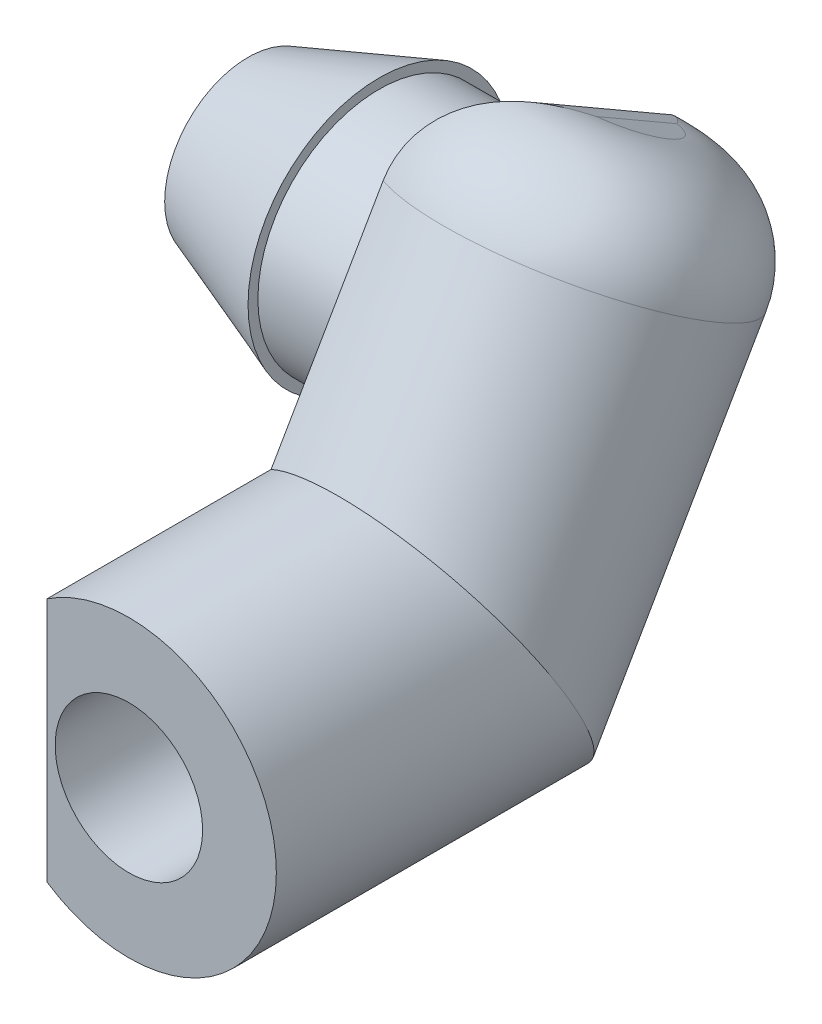
ISO-10303-21;
HEADER;
FILE_DESCRIPTION(('STEP AP214'),'2;1');
FILE_NAME('part.step','',(''),(''),'','','');
FILE_SCHEMA(('AUTOMOTIVE_DESIGN { 1 0 10303 214 1 1 1 1 }'));
ENDSEC;
DATA;
#1=APPLICATION_CONTEXT('core data for automotive mechanical design processes');
#2=APPLICATION_PROTOCOL_DEFINITION('international standard','automotive_design',2000,#1);
#3=PRODUCT_CONTEXT('',#1,'mechanical');
#4=PRODUCT('Part','Part','',(#3));
#5=PRODUCT_RELATED_PRODUCT_CATEGORY('part','',(#4));
#6=PRODUCT_DEFINITION_FORMATION('','',#4);
#7=PRODUCT_DEFINITION_CONTEXT('part definition',#1,'design');
#8=PRODUCT_DEFINITION('design','',#6,#7);
#9=PRODUCT_DEFINITION_SHAPE('','',#8);
#10=(LENGTH_UNIT() NAMED_UNIT(*) SI_UNIT(.MILLI.,.METRE.));
#11=(NAMED_UNIT(*) PLANE_ANGLE_UNIT() SI_UNIT($,.RADIAN.));
#12=(NAMED_UNIT(*) SI_UNIT($,.STERADIAN.) SOLID_ANGLE_UNIT());
#13=UNCERTAINTY_MEASURE_WITH_UNIT(LENGTH_MEASURE(1.E-05),#10,'distance_accuracy_value','');
#14=(GEOMETRIC_REPRESENTATION_CONTEXT(3) GLOBAL_UNCERTAINTY_ASSIGNED_CONTEXT((#13)) GLOBAL_UNIT_ASSIGNED_CONTEXT((#10,
#11,#12)) REPRESENTATION_CONTEXT('',''));
#15=CARTESIAN_POINT('',(0.,0.,0.));
#16=DIRECTION('',(0.,0.,1.));
#17=DIRECTION('',(1.,0.,0.));
#18=AXIS2_PLACEMENT_3D('',#15,#16,#17);
#19=CARTESIAN_POINT('',(-1.25,-0.804310319560903,-1.87538432102024));
#20=DIRECTION('',(1.,0.,0.));
#21=DIRECTION('',(0.,0.,-1.));
#22=AXIS2_PLACEMENT_3D('',#19,#20,#21);
#23=PLANE('',#22);
#24=DIRECTION('',(0.,-0.499999999999998,-0.86602540378444));
#25=VECTOR('',#24,1.);
#26=CARTESIAN_POINT('',(-1.25,4.83252866372346,-5.12981482539802));
#27=LINE('',#26,#25);
#28=CARTESIAN_POINT('',(-1.25,4.83252866372346,-5.12981482539802));
#29=VERTEX_POINT('',#28);
#30=CARTESIAN_POINT('',(-1.25,4.66491909115015,-5.42012312092989));
#31=VERTEX_POINT('',#30);
#32=EDGE_CURVE('E272',#29,#31,#27,.T.);
#33=ORIENTED_EDGE('',*,*,#32,.T.);
#34=CARTESIAN_POINT('',(-1.25,3.02067456655205,-6.26803817760076));
#35=DIRECTION('',(-1.,0.,0.));
#36=DIRECTION('',(0.,0.,1.));
#37=AXIS2_PLACEMENT_3D('',#34,#35,#36);
#38=CIRCLE('',#37,1.85);
#39=CARTESIAN_POINT('',(-1.25,2.09567456655206,-7.87018517460196));
#40=VERTEX_POINT('',#39);
#41=EDGE_CURVE('E59',#40,#31,#38,.T.);
#42=ORIENTED_EDGE('',*,*,#41,.F.);
#43=DIRECTION('',(0.,0.86602540378444,-0.499999999999998));
#44=VECTOR('',#43,1.);
#45=CARTESIAN_POINT('',(-1.25,-2.67513901294786,-5.11575467022417));
#46=LINE('',#45,#44);
#47=CARTESIAN_POINT('',(-1.25,-1.87082869338697,-5.58012344973465));
#48=VERTEX_POINT('',#47);
#49=EDGE_CURVE('E251',#48,#40,#46,.T.);
#50=ORIENTED_EDGE('',*,*,#49,.F.);
#51=DIRECTION('',(0.,0.866025403784438,0.500000000000001));
#52=VECTOR('',#51,1.);
#53=CARTESIAN_POINT('',(-1.25,3.35167867855522,-2.56490741269901));
#54=LINE('',#53,#52);
#55=CARTESIAN_POINT('',(-1.25,1.87082869338697,-3.41987655026535));
#56=VERTEX_POINT('',#55);
#57=EDGE_CURVE('E299',#48,#56,#54,.T.);
#58=ORIENTED_EDGE('',*,*,#57,.T.);
#59=DIRECTION('',(0.,0.86602540378444,-0.499999999999998));
#60=VECTOR('',#59,1.);
#61=CARTESIAN_POINT('',(-1.25,-0.804310319560903,-1.87538432102024));
#62=LINE('',#61,#60);
#63=EDGE_CURVE('E266',#56,#29,#62,.T.);
#64=ORIENTED_EDGE('',*,*,#63,.T.);
#65=EDGE_LOOP('',(#33,#42,#50,#58,#64));
#66=FACE_BOUND('',#65,.T.);
#67=ADVANCED_FACE('F35',(#66),#23,.F.);
#68=CARTESIAN_POINT('',(0.,5.19615242270664,-7.49999999999998));
#69=DIRECTION('',(0.,-0.86602540378444,0.499999999999998));
#70=DIRECTION('',(1.,0.,0.));
#71=AXIS2_PLACEMENT_3D('',#68,#69,#70);
#72=PLANE('',#71);
#73=CARTESIAN_POINT('',(0.,5.19615242270664,-7.49999999999998));
#74=DIRECTION('',(0.,-0.86602540378444,0.499999999999998));
#75=DIRECTION('',(0.,-0.499999999999998,-0.86602540378444));
#76=AXIS2_PLACEMENT_3D('',#73,#74,#75);
#77=CIRCLE('',#76,0.75);
#78=CARTESIAN_POINT('',(0.25,5.54970581329991,-6.88762756430419));
#79=VERTEX_POINT('',#78);
#80=CARTESIAN_POINT('',(0.25,4.84259903211337,-8.11237243569578));
#81=VERTEX_POINT('',#80);
#82=EDGE_CURVE('E274',#79,#81,#77,.F.);
#83=ORIENTED_EDGE('',*,*,#82,.T.);
#84=DIRECTION('',(0.,-0.499999999999998,-0.86602540378444));
#85=VECTOR('',#84,1.);
#86=CARTESIAN_POINT('',(0.25,5.19615242270664,-7.49999999999998));
#87=LINE('',#86,#85);
#88=EDGE_CURVE('E276',#81,#79,#87,.F.);
#89=ORIENTED_EDGE('',*,*,#88,.T.);
#90=EDGE_LOOP('',(#83,#89));
#91=FACE_BOUND('',#90,.T.);
#92=ADVANCED_FACE('F213',(#91),#72,.F.);
#93=CARTESIAN_POINT('',(0.,0.,0.));
#94=DIRECTION('',(0.,0.,1.));
#95=DIRECTION('',(1.,0.,0.));
#96=AXIS2_PLACEMENT_3D('',#93,#94,#95);
#97=PLANE('',#96);
#98=CARTESIAN_POINT('',(0.,0.,0.));
#99=DIRECTION('',(0.,0.,1.));
#100=DIRECTION('',(1.,0.,0.));
#101=AXIS2_PLACEMENT_3D('',#98,#99,#100);
#102=CIRCLE('',#101,1.125);
#103=CARTESIAN_POINT('',(1.125,0.,0.));
#104=VERTEX_POINT('',#103);
#105=EDGE_CURVE('E169',#104,#104,#102,.T.);
#106=ORIENTED_EDGE('',*,*,#105,.F.);
#107=EDGE_LOOP('',(#106));
#108=FACE_BOUND('',#107,.T.);
#109=CARTESIAN_POINT('',(0.,0.,0.));
#110=DIRECTION('',(0.,0.,1.));
#111=DIRECTION('',(1.,0.,0.));
#112=AXIS2_PLACEMENT_3D('',#109,#110,#111);
#113=CIRCLE('',#112,2.25);
#114=CARTESIAN_POINT('',(-1.25,-1.87082869338697,0.));
#115=VERTEX_POINT('',#114);
#116=CARTESIAN_POINT('',(-1.25,1.87082869338697,0.));
#117=VERTEX_POINT('',#116);
#118=EDGE_CURVE('E258',#115,#117,#113,.T.);
#119=ORIENTED_EDGE('',*,*,#118,.T.);
#120=DIRECTION('',(0.,-1.,0.));
#121=VECTOR('',#120,1.);
#122=CARTESIAN_POINT('',(-1.25,1.87082869338697,0.));
#123=LINE('',#122,#121);
#124=EDGE_CURVE('E306',#117,#115,#123,.T.);
#125=ORIENTED_EDGE('',*,*,#124,.T.);
#126=EDGE_LOOP('',(#119,#125));
#127=FACE_BOUND('',#126,.T.);
#128=ADVANCED_FACE('F220',(#108,#127),#97,.T.);
#129=CARTESIAN_POINT('',(0.,-1.73972466625438,-3.49556949562221));
#130=DIRECTION('',(0.,0.86602540378444,-0.499999999999998));
#131=DIRECTION('',(0.,0.499999999999998,0.86602540378444));
#132=AXIS2_PLACEMENT_3D('',#129,#130,#131);
#133=CYLINDRICAL_SURFACE('',#132,2.25);
#134=ORIENTED_EDGE('',*,*,#49,.T.);
#135=CARTESIAN_POINT('',(-1.25,2.9616999703365,-8.37018517460196));
#136=VERTEX_POINT('',#135);
#137=EDGE_CURVE('E252',#40,#136,#46,.T.);
#138=ORIENTED_EDGE('',*,*,#137,.T.);
#139=CARTESIAN_POINT('',(0.,3.89711431702998,-6.74999999999999));
#140=DIRECTION('',(0.,-0.86602540378444,0.499999999999998));
#141=DIRECTION('',(0.,-0.499999999999998,-0.86602540378444));
#142=AXIS2_PLACEMENT_3D('',#139,#140,#141);
#143=CIRCLE('',#142,2.25);
#144=EDGE_CURVE('E124',#136,#29,#143,.T.);
#145=ORIENTED_EDGE('',*,*,#144,.T.);
#146=ORIENTED_EDGE('',*,*,#63,.F.);
#147=CARTESIAN_POINT('',(0.,0.,-4.5));
#148=DIRECTION('',(0.,0.500000000000001,-0.866025403784438));
#149=DIRECTION('',(0.,-0.866025403784438,-0.500000000000001));
#150=AXIS2_PLACEMENT_3D('',#147,#148,#149);
#151=ELLIPSE('',#150,2.59807621135332,2.25);
#152=EDGE_CURVE('E255',#56,#48,#151,.T.);
#153=ORIENTED_EDGE('',*,*,#152,.T.);
#154=EDGE_LOOP('',(#134,#138,#145,#146,#153));
#155=FACE_BOUND('',#154,.T.);
#156=ADVANCED_FACE('F228',(#155),#133,.T.);
#157=ORIENTED_EDGE('',*,*,#137,.F.);
#158=CARTESIAN_POINT('',(-1.25,3.10848084952282,-8.11595323427161));
#159=VERTEX_POINT('',#158);
#160=EDGE_CURVE('E159',#159,#40,#38,.T.);
#161=ORIENTED_EDGE('',*,*,#160,.F.);
#162=EDGE_CURVE('E264',#159,#136,#27,.T.);
#163=ORIENTED_EDGE('',*,*,#162,.T.);
#164=EDGE_LOOP('',(#157,#161,#163));
#165=FACE_BOUND('',#164,.T.);
#166=ADVANCED_FACE('F215',(#165),#23,.F.);
#167=CARTESIAN_POINT('',(-1.25,1.87082869338697,0.));
#168=DIRECTION('',(1.,0.,0.));
#169=DIRECTION('',(0.,0.,-1.));
#170=AXIS2_PLACEMENT_3D('',#167,#168,#169);
#171=PLANE('',#170);
#172=DIRECTION('',(0.,0.,-1.));
#173=VECTOR('',#172,1.);
#174=CARTESIAN_POINT('',(-1.25,-1.87082869338697,0.));
#175=LINE('',#174,#173);
#176=EDGE_CURVE('E308',#115,#48,#175,.T.);
#177=ORIENTED_EDGE('',*,*,#176,.F.);
#178=ORIENTED_EDGE('',*,*,#124,.F.);
#179=DIRECTION('',(0.,0.,-1.));
#180=VECTOR('',#179,1.);
#181=CARTESIAN_POINT('',(-1.25,1.87082869338697,0.));
#182=LINE('',#181,#180);
#183=EDGE_CURVE('E302',#117,#56,#182,.T.);
#184=ORIENTED_EDGE('',*,*,#183,.T.);
#185=ORIENTED_EDGE('',*,*,#57,.F.);
#186=EDGE_LOOP('',(#177,#178,#184,#185));
#187=FACE_BOUND('',#186,.T.);
#188=ADVANCED_FACE('F227',(#187),#171,.F.);
#189=CARTESIAN_POINT('',(0.,0.,0.));
#190=DIRECTION('',(0.,0.,-1.));
#191=DIRECTION('',(-1.,0.,0.));
#192=AXIS2_PLACEMENT_3D('',#189,#190,#191);
#193=CYLINDRICAL_SURFACE('',#192,2.25);
#194=ORIENTED_EDGE('',*,*,#183,.F.);
#195=ORIENTED_EDGE('',*,*,#118,.F.);
#196=ORIENTED_EDGE('',*,*,#176,.T.);
#197=ORIENTED_EDGE('',*,*,#152,.F.);
#198=EDGE_LOOP('',(#194,#195,#196,#197));
#199=FACE_BOUND('',#198,.T.);
#200=ADVANCED_FACE('F216',(#199),#193,.T.);
#201=CARTESIAN_POINT('',(0.,3.89711431702998,-6.74999999999999));
#202=DIRECTION('',(0.,-0.86602540378444,0.499999999999998));
#203=DIRECTION('',(0.,-0.499999999999998,-0.86602540378444));
#204=AXIS2_PLACEMENT_3D('',#201,#202,#203);
#205=DEGENERATE_TOROIDAL_SURFACE('',#204,0.75,1.5,.T.);
#206=CARTESIAN_POINT('',(-1.25,2.9616999703365,-8.37018517460196));
#207=CARTESIAN_POINT('',(-1.25000185479303,2.99479987181354,-8.38929473665628));
#208=CARTESIAN_POINT('',(-1.24853809279602,3.02827310512128,-8.40771909432136));
#209=CARTESIAN_POINT('',(-1.24271278594958,3.0957432628677,-8.44307374989157));
#210=CARTESIAN_POINT('',(-1.23835185493461,3.1297400748836,-8.46000436342148));
#211=CARTESIAN_POINT('',(-1.22101743592931,3.23193810336593,-8.50825691182083));
#212=CARTESIAN_POINT('',(-1.20379173667515,3.30060683069265,-8.53718948360161));
#213=CARTESIAN_POINT('',(-1.15881907855963,3.437114660384,-8.5876822704788));
#214=CARTESIAN_POINT('',(-1.13107520035981,3.50495399966777,-8.60924464071501));
#215=CARTESIAN_POINT('',(-1.06632808373223,3.63825290162302,-8.64439350943134));
#216=CARTESIAN_POINT('',(-1.02932124805396,3.70371152841237,-8.65797690241725));
#217=CARTESIAN_POINT('',(-0.946317688210517,3.83296422819545,-8.67705115237366));
#218=CARTESIAN_POINT('',(-0.900069594258949,3.89663659593368,-8.68226698534826));
#219=CARTESIAN_POINT('',(-0.801343058142091,4.01902622294201,-8.68356884724809));
#220=CARTESIAN_POINT('',(-0.74886300728282,4.07774219606577,-8.67965251394676));
#221=CARTESIAN_POINT('',(-0.634585325110853,4.19489437015482,-8.66190901299882));
#222=CARTESIAN_POINT('',(-0.572375272555579,4.25279158575031,-8.64718981376087));
#223=CARTESIAN_POINT('',(-0.445543018425509,4.3618717613418,-8.60707231393778));
#224=CARTESIAN_POINT('',(-0.380918963935079,4.4130494216905,-8.58166564985283));
#225=CARTESIAN_POINT('',(-0.243615062410326,4.51525937312719,-8.51660363132636));
#226=CARTESIAN_POINT('',(-0.170964010711523,4.56543278971332,-8.47553967205553));
#227=CARTESIAN_POINT('',(-0.0298225192133308,4.65918926734154,-8.3809494183145));
#228=CARTESIAN_POINT('',(0.0386724069630731,4.70277951319664,-8.32743687460706));
#229=CARTESIAN_POINT('',(0.153444321717618,4.77697723425207,-8.22152697176461));
#230=CARTESIAN_POINT('',(0.201317225497368,4.80834933404259,-8.1714075276888));
#231=CARTESIAN_POINT('',(0.246924781731042,4.84042751800417,-8.11612894617689));
#232=CARTESIAN_POINT('',(0.248464759539056,4.84151349086549,-8.11425270366045));
#233=CARTESIAN_POINT('',(0.25,4.84259903211337,-8.11237243569578));
#234=B_SPLINE_CURVE_WITH_KNOTS('',3,(#206,#207,#208,#209,#210,#211,#212,#213,#214,#215,#216,
#217,#218,#219,#220,#221,#222,#223,#224,#225,#226,#227,#228,#229,#230,#231,#232,#233),
.UNSPECIFIED.,.F.,.F.,(4,2,2,2,2,2,2,2,2,2,2,2,2,4),(0.,0.114586572621303,0.229148875079892,
0.457385298715112,0.685554925934998,0.913813300213431,1.14943077072409,1.38510919540159,
1.64281343984222,1.90071972759309,2.19167251062179,2.48230541927415,2.70987022510459,
2.71784769081054),.UNSPECIFIED.);
#235=EDGE_CURVE('E280',#81,#136,#234,.F.);
#236=ORIENTED_EDGE('',*,*,#235,.F.);
#237=ORIENTED_EDGE('',*,*,#82,.F.);
#238=CARTESIAN_POINT('',(-1.25,4.83252866372346,-5.12981482539802));
#239=CARTESIAN_POINT('',(-1.25000185479303,4.86562798065622,-5.14892539991274));
#240=CARTESIAN_POINT('',(-1.24853809279602,4.89832055909647,-5.16870189147151));
#241=CARTESIAN_POINT('',(-1.24271278594958,4.96267366783553,-5.20945543429214));
#242=CARTESIAN_POINT('',(-1.23835185493461,4.99433441526203,-5.23043223038063));
#243=CARTESIAN_POINT('',(-1.22101743592931,5.08722136221437,-5.29481204506334));
#244=CARTESIAN_POINT('',(-1.20379173667515,5.14661206803671,-5.33981462148344));
#245=CARTESIAN_POINT('',(-1.15881907855963,5.2585940190259,-5.43278747637304));
#246=CARTESIAN_POINT('',(-1.13107520035981,5.31118724905815,-5.48075688245063));
#247=CARTESIAN_POINT('',(-1.06632808373223,5.4082765132584,-5.57862268348229));
#248=CARTESIAN_POINT('',(-1.02932124805396,5.45276939004846,-5.62851982068574));
#249=CARTESIAN_POINT('',(-0.946317688210518,5.53391452496038,-5.73091881722741));
#250=CARTESIAN_POINT('',(-0.90006959425895,5.57026775268741,-5.78345278872052));
#251=CARTESIAN_POINT('',(-0.801343058142091,5.63259001166904,-5.88879438391952));
#252=CARTESIAN_POINT('',(-0.748863007282821,5.65855635410228,-5.94160207490329));
#253=CARTESIAN_POINT('',(-0.634585325110855,5.70176611857382,-6.05193058424695));
#254=CARTESIAN_POINT('',(-0.572375272555582,5.71796752590813,-6.10943064338001));
#255=CARTESIAN_POINT('',(-0.445543018425511,5.73776483972076,-6.22395559640305));
#256=CARTESIAN_POINT('',(-0.380918963935079,5.74135085337213,-6.28098008241375));
#257=CARTESIAN_POINT('',(-0.243615062410326,5.73611046822506,-6.40202750614073));
#258=CARTESIAN_POINT('',(-0.170964010711527,5.72563474460962,-6.46601093913441));
#259=CARTESIAN_POINT('',(-0.0298225192133172,5.69059542073358,-6.5945015574003));
#260=CARTESIAN_POINT('',(0.0386724069631085,5.66604732138938,-6.65900808952172));
#261=CARTESIAN_POINT('',(0.153444321717592,5.61142551554316,-6.77622015227991));
#262=CARTESIAN_POINT('',(0.20131722549728,5.58370685364519,-6.82844890970649));
#263=CARTESIAN_POINT('',(0.246924781731036,5.55187328975154,-6.8838687226804));
#264=CARTESIAN_POINT('',(0.248464759539053,5.5507914024993,-6.88574732402434));
#265=CARTESIAN_POINT('',(0.25,5.54970581329991,-6.88762756430419));
#266=B_SPLINE_CURVE_WITH_KNOTS('',3,(#238,#239,#240,#241,#242,#243,#244,#245,#246,#247,#248,
#249,#250,#251,#252,#253,#254,#255,#256,#257,#258,#259,#260,#261,#262,#263,#264,#265),
.UNSPECIFIED.,.F.,.F.,(4,2,2,2,2,2,2,2,2,2,2,2,2,4),(0.,0.114586572621303,0.229148875079893,
0.457385298715112,0.685554925934997,0.91381330021343,1.14943077072409,1.38510919540159,
1.64281343984222,1.90071972759309,2.1916725106218,2.48230541927415,2.70987022510459,
2.71784769081054),.UNSPECIFIED.);
#267=EDGE_CURVE('E268',#29,#79,#266,.T.);
#268=ORIENTED_EDGE('',*,*,#267,.F.);
#269=ORIENTED_EDGE('',*,*,#144,.F.);
#270=EDGE_LOOP('',(#236,#237,#268,#269));
#271=FACE_BOUND('',#270,.T.);
#272=ADVANCED_FACE('F223',(#271),#205,.T.);
#273=CARTESIAN_POINT('',(0.25,4.83252866372346,-5.12981482539802));
#274=DIRECTION('',(0.,-0.499999999999998,-0.86602540378444));
#275=DIRECTION('',(0.,0.86602540378444,-0.499999999999998));
#276=AXIS2_PLACEMENT_3D('',#273,#274,#275);
#277=CYLINDRICAL_SURFACE('',#276,1.5);
#278=CARTESIAN_POINT('',(-1.25,3.10848084952282,-8.11595323427161));
#279=CARTESIAN_POINT('',(-1.25000121979341,3.15568209905398,-8.11371617164791));
#280=CARTESIAN_POINT('',(-1.24841961478353,3.20274527765012,-8.10966123031111));
#281=CARTESIAN_POINT('',(-1.24258977067846,3.29619581170267,-8.09801009451203));
#282=CARTESIAN_POINT('',(-1.23834561930391,3.34258409180802,-8.09041933307076));
#283=CARTESIAN_POINT('',(-1.22244273194947,3.47961848018348,-8.06261539963345));
#284=CARTESIAN_POINT('',(-1.20759742293953,3.56890090876588,-8.03733146035033));
#285=CARTESIAN_POINT('',(-1.17336029017098,3.74135229071632,-7.97435742976077));
#286=CARTESIAN_POINT('',(-1.15399301659849,3.82455117781576,-7.93673390004377));
#287=CARTESIAN_POINT('',(-1.11427709602543,3.98460804671633,-7.84970360750478));
#288=CARTESIAN_POINT('',(-1.09392549436535,4.06144478472365,-7.80025935413135));
#289=CARTESIAN_POINT('',(-1.05300766425374,4.21919614191746,-7.68128382354646));
#290=CARTESIAN_POINT('',(-1.03292448799233,4.29880794974842,-7.60980685989774));
#291=CARTESIAN_POINT('',(-1.00991330576056,4.40853962988092,-7.49245662158683));
#292=CARTESIAN_POINT('',(-1.00343104098379,4.44347656280902,-7.45169023690101));
#293=CARTESIAN_POINT('',(-0.993349655175067,4.50982982396225,-7.36703917023715));
#294=CARTESIAN_POINT('',(-0.989749802862696,4.54124704341302,-7.32315528226105));
#295=CARTESIAN_POINT('',(-0.986000164153716,4.59679253604923,-7.23790170757889));
#296=CARTESIAN_POINT('',(-0.985501666041694,4.62134353393797,-7.19682198815949));
#297=CARTESIAN_POINT('',(-0.987051878414749,4.6671765408437,-7.11291749131962));
#298=CARTESIAN_POINT('',(-0.989101454927156,4.68845743567114,-7.07009212538298));
#299=CARTESIAN_POINT('',(-0.998900113700345,4.74713619458937,-6.93953546980131));
#300=CARTESIAN_POINT('',(-1.01029801577574,4.77938843914876,-6.84969542221347));
#301=CARTESIAN_POINT('',(-1.03871039863274,4.82761553043493,-6.67438517065895));
#302=CARTESIAN_POINT('',(-1.05522477346422,4.84465259183349,-6.58911121615684));
#303=CARTESIAN_POINT('',(-1.09089104291814,4.86665969511932,-6.41746534415762));
#304=CARTESIAN_POINT('',(-1.11004658024269,4.87161289139904,-6.33109206244127));
#305=CARTESIAN_POINT('',(-1.15145751959942,4.86923408532974,-6.14177584010029));
#306=CARTESIAN_POINT('',(-1.17360251230076,4.85936261930742,-6.03883338099754));
#307=CARTESIAN_POINT('',(-1.21172750019582,4.82225956608644,-5.83511563908045));
#308=CARTESIAN_POINT('',(-1.22772940474007,4.79509061010414,-5.73433388800571));
#309=CARTESIAN_POINT('',(-1.24176803046921,4.74602646623433,-5.59930407528847));
#310=CARTESIAN_POINT('',(-1.24478270851941,4.73144154159441,-5.56282685222183));
#311=CARTESIAN_POINT('',(-1.24889945449133,4.69992472679725,-5.49075706733895));
#312=CARTESIAN_POINT('',(-1.24999996237084,4.68299093444426,-5.45516525038762));
#313=CARTESIAN_POINT('',(-1.25,4.66491909115015,-5.42012312092989));
#314=B_SPLINE_CURVE_WITH_KNOTS('',3,(#278,#279,#280,#281,#282,#283,#284,#285,#286,#287,#288,
#289,#290,#291,#292,#293,#294,#295,#296,#297,#298,#299,#300,#301,#302,#303,#304,#305,#306,#307,
#308,#309,#310,#311,#312,#313),.UNSPECIFIED.,.F.,.F.,(4,2,2,2,2,2,2,2,2,2,2,2,2,2,2,2,2,4),(0.,
0.141616962720465,0.283017035833863,0.563547721889873,0.842589409430655,1.12252812756175,
1.44709634485264,1.6091013976754,1.77106533608545,1.91443045887446,2.05784432123449,
2.34457271448195,2.60922102894377,2.87423806819121,3.19010308915768,3.50483087199597,
3.62292517315779,3.74111567575705),.UNSPECIFIED.);
#315=EDGE_CURVE('E157',#159,#31,#314,.T.);
#316=ORIENTED_EDGE('',*,*,#315,.T.);
#317=ORIENTED_EDGE('',*,*,#32,.F.);
#318=ORIENTED_EDGE('',*,*,#267,.T.);
#319=ORIENTED_EDGE('',*,*,#88,.F.);
#320=ORIENTED_EDGE('',*,*,#235,.T.);
#321=ORIENTED_EDGE('',*,*,#162,.F.);
#322=EDGE_LOOP('',(#316,#317,#318,#319,#320,#321));
#323=FACE_BOUND('',#322,.T.);
#324=ADVANCED_FACE('F37',(#323),#277,.T.);
#325=CARTESIAN_POINT('',(0.,0.,-5.7));
#326=DIRECTION('',(0.,0.,1.));
#327=DIRECTION('',(1.,0.,0.));
#328=AXIS2_PLACEMENT_3D('',#325,#326,#327);
#329=CYLINDRICAL_SURFACE('',#328,1.125);
#330=CARTESIAN_POINT('',(0.,0.,-5.7));
#331=DIRECTION('',(0.,0.,1.));
#332=DIRECTION('',(1.,0.,0.));
#333=AXIS2_PLACEMENT_3D('',#330,#331,#332);
#334=CIRCLE('',#333,1.125);
#335=CARTESIAN_POINT('',(1.125,0.,-5.7));
#336=VERTEX_POINT('',#335);
#337=EDGE_CURVE('E170',#336,#336,#334,.T.);
#338=ORIENTED_EDGE('',*,*,#337,.F.);
#339=EDGE_LOOP('',(#338));
#340=FACE_BOUND('',#339,.T.);
#341=ORIENTED_EDGE('',*,*,#105,.T.);
#342=EDGE_LOOP('',(#341));
#343=FACE_BOUND('',#342,.T.);
#344=ADVANCED_FACE('F242',(#340,#343),#329,.F.);
#345=CARTESIAN_POINT('',(0.,0.,-5.7));
#346=DIRECTION('',(0.,0.,1.));
#347=DIRECTION('',(1.,0.,0.));
#348=AXIS2_PLACEMENT_3D('',#345,#346,#347);
#349=PLANE('',#348);
#350=ORIENTED_EDGE('',*,*,#337,.T.);
#351=EDGE_LOOP('',(#350));
#352=FACE_BOUND('',#351,.T.);
#353=ADVANCED_FACE('F319',(#352),#349,.T.);
#354=CARTESIAN_POINT('',(7.04671759153915,3.02067456655205,-6.26803817760076));
#355=DIRECTION('',(-1.,0.,0.));
#356=DIRECTION('',(0.,0.,1.));
#357=AXIS2_PLACEMENT_3D('',#354,#355,#356);
#358=CYLINDRICAL_SURFACE('',#357,1.85);
#359=ORIENTED_EDGE('',*,*,#315,.F.);
#360=ORIENTED_EDGE('',*,*,#160,.T.);
#361=ORIENTED_EDGE('',*,*,#41,.T.);
#362=EDGE_LOOP('',(#359,#360,#361));
#363=FACE_BOUND('',#362,.T.);
#364=CARTESIAN_POINT('',(-2.45,3.02067456655205,-6.26803817760076));
#365=DIRECTION('',(-1.,0.,0.));
#366=DIRECTION('',(0.,0.,1.));
#367=AXIS2_PLACEMENT_3D('',#364,#365,#366);
#368=CIRCLE('',#367,1.85);
#369=CARTESIAN_POINT('',(-2.45,3.37067456655205,-8.08462839005925));
#370=VERTEX_POINT('',#369);
#371=CARTESIAN_POINT('',(-2.45,2.67067456655205,-8.08462839005925));
#372=VERTEX_POINT('',#371);
#373=EDGE_CURVE('E155',#370,#372,#368,.T.);
#374=ORIENTED_EDGE('',*,*,#373,.F.);
#375=EDGE_CURVE('E158',#372,#370,#368,.T.);
#376=ORIENTED_EDGE('',*,*,#375,.F.);
#377=EDGE_LOOP('',(#374,#376));
#378=FACE_BOUND('',#377,.T.);
#379=ADVANCED_FACE('F172',(#363,#378),#358,.T.);
#380=CARTESIAN_POINT('',(-2.45,3.02067456655205,-6.26803817760076));
#381=DIRECTION('',(1.,0.,0.));
#382=DIRECTION('',(0.,0.,1.));
#383=AXIS2_PLACEMENT_3D('',#380,#381,#382);
#384=CONICAL_SURFACE('',#383,2.,0.349065850398867);
#385=CARTESIAN_POINT('',(-2.45,3.02067456655205,-6.26803817760076));
#386=DIRECTION('',(-1.,0.,0.));
#387=DIRECTION('',(0.,0.,1.));
#388=AXIS2_PLACEMENT_3D('',#385,#386,#387);
#389=CIRCLE('',#388,2.);
#390=CARTESIAN_POINT('',(-2.45,2.67067456655205,-8.23717504435228));
#391=VERTEX_POINT('',#390);
#392=CARTESIAN_POINT('',(-2.45,3.37067456655205,-8.23717504435228));
#393=VERTEX_POINT('',#392);
#394=EDGE_CURVE('E144',#391,#393,#389,.T.);
#395=ORIENTED_EDGE('',*,*,#394,.T.);
#396=CARTESIAN_POINT('',(0.274626545165057,3.37067456655205,-9.23917717547885));
#397=CARTESIAN_POINT('',(-0.0767274110743697,3.37067456655205,-9.11039265895739));
#398=CARTESIAN_POINT('',(-0.428055152201747,3.37067456655205,-8.9815360378641));
#399=CARTESIAN_POINT('',(-1.13066347969897,3.37067456655205,-8.72348416475769));
#400=CARTESIAN_POINT('',(-1.4819440437413,3.37067456655205,-8.5942888519676));
#401=CARTESIAN_POINT('',(-2.17924441187454,3.37067456655205,-8.33728824583657));
#402=CARTESIAN_POINT('',(-2.52526677472369,3.37067456655205,-8.20948989616866));
#403=CARTESIAN_POINT('',(-3.21694706928524,3.37067456655205,-7.95310559914733));
#404=CARTESIAN_POINT('',(-3.56260505689296,3.37067456655205,-7.82451980299949));
#405=CARTESIAN_POINT('',(-4.0742376454568,3.37067456655205,-7.63277391333551));
#406=CARTESIAN_POINT('',(-4.24045362915212,3.37067456655205,-7.57025874117592));
#407=CARTESIAN_POINT('',(-4.57273006817565,3.37067456655205,-7.44459175125648));
#408=CARTESIAN_POINT('',(-4.73879042034326,3.37067456655205,-7.38143966059063));
#409=CARTESIAN_POINT('',(-5.07206401364978,3.37067456655205,-7.25358347109052));
#410=CARTESIAN_POINT('',(-5.23927384959226,3.37067456655205,-7.18887044795712));
#411=CARTESIAN_POINT('',(-5.4894349409236,3.37067456655205,-7.09048247839754));
#412=CARTESIAN_POINT('',(-5.57265427580024,3.37067456655205,-7.05749059873753));
#413=CARTESIAN_POINT('',(-5.7388235912935,3.37067456655205,-6.99084629941036));
#414=CARTESIAN_POINT('',(-5.82177358518172,3.37067456655205,-6.95719391288306));
#415=CARTESIAN_POINT('',(-5.9874112070593,3.37067456655205,-6.88884594914587));
#416=CARTESIAN_POINT('',(-6.07009814885906,3.37067456655205,-6.85414869501307));
#417=CARTESIAN_POINT('',(-6.19377870277282,3.37067456655205,-6.8008026056624));
#418=CARTESIAN_POINT('',(-6.23503491387753,3.37067456655205,-6.78276397835575));
#419=CARTESIAN_POINT('',(-6.31728475709601,3.37067456655205,-6.74613600202387));
#420=CARTESIAN_POINT('',(-6.35827847972579,3.37067456655205,-6.72754685683024));
#421=CARTESIAN_POINT('',(-6.4395704272291,3.37067456655205,-6.68975924106851));
#422=CARTESIAN_POINT('',(-6.47987160149362,3.37067456655205,-6.67056716970941));
#423=CARTESIAN_POINT('',(-6.5599880505479,3.37067456655205,-6.63105509016111));
#424=CARTESIAN_POINT('',(-6.59980257324386,3.37067456655205,-6.61073355332798));
#425=CARTESIAN_POINT('',(-6.67825835181021,3.37067456655205,-6.56854355374765));
#426=CARTESIAN_POINT('',(-6.71690604754658,3.37067456655205,-6.54668745632738));
#427=CARTESIAN_POINT('',(-6.77348651661276,3.37067456655205,-6.51172932211961));
#428=CARTESIAN_POINT('',(-6.79209482330612,3.37067456655205,-6.49972888671588));
#429=CARTESIAN_POINT('',(-6.82860163615551,3.37067456655205,-6.4747010529462));
#430=CARTESIAN_POINT('',(-6.84650067069913,3.37067456655205,-6.46167444152402));
#431=CARTESIAN_POINT('',(-6.87266762940358,3.37067456655205,-6.44083255311381));
#432=CARTESIAN_POINT('',(-6.88137347883515,3.37067456655205,-6.43357588420279));
#433=CARTESIAN_POINT('',(-6.89834568911806,3.37067456655205,-6.41856293014199));
#434=CARTESIAN_POINT('',(-6.90661153645898,3.37067456655205,-6.41080608362033));
#435=CARTESIAN_POINT('',(-6.93036122700316,3.37067456655205,-6.38676261705265));
#436=CARTESIAN_POINT('',(-6.94502118904501,3.37067456655205,-6.36953606683743));
#437=CARTESIAN_POINT('',(-6.96151129646433,3.37067456655205,-6.3433495959668));
#438=CARTESIAN_POINT('',(-6.9656643047225,3.37067456655205,-6.33587726708394));
#439=CARTESIAN_POINT('',(-6.97286224188125,3.37067456655205,-6.32040097386344));
#440=CARTESIAN_POINT('',(-6.97590720160265,3.37067456655205,-6.31239702432037));
#441=CARTESIAN_POINT('',(-6.9805723080935,3.37067456655205,-6.29585422742622));
#442=CARTESIAN_POINT('',(-6.98217325211873,3.37067456655205,-6.28730974319828));
#443=CARTESIAN_POINT('',(-6.98361123583205,3.37067456655205,-6.27007671958792));
#444=CARTESIAN_POINT('',(-6.98345061030803,3.37067456655205,-6.26138838611977));
#445=CARTESIAN_POINT('',(-6.9815532706528,3.37067456655205,-6.24547241436579));
#446=CARTESIAN_POINT('',(-6.98004782931275,3.37067456655205,-6.23821523298409));
#447=CARTESIAN_POINT('',(-6.9759551246222,3.37067456655205,-6.22401421290471));
#448=CARTESIAN_POINT('',(-6.97336682262463,3.37067456655205,-6.21707068215482));
#449=CARTESIAN_POINT('',(-6.96535972694491,3.37067456655205,-6.19915419516209));
#450=CARTESIAN_POINT('',(-6.95919710046404,3.37067456655205,-6.18851813177106));
#451=CARTESIAN_POINT('',(-6.94538949320498,3.37067456655205,-6.16825789562484));
#452=CARTESIAN_POINT('',(-6.93773925250148,3.37067456655205,-6.15863750603054));
#453=CARTESIAN_POINT('',(-6.91771854908501,3.37067456655205,-6.1359278514135));
#454=CARTESIAN_POINT('',(-6.90481281814124,3.37067456655205,-6.1233181828081));
#455=CARTESIAN_POINT('',(-6.87788317812015,3.37067456655205,-6.09933780483328));
#456=CARTESIAN_POINT('',(-6.86385657075129,3.37067456655205,-6.08797025129877));
#457=CARTESIAN_POINT('',(-6.83503015146789,3.37067456655205,-6.06606704995816));
#458=CARTESIAN_POINT('',(-6.82022590152337,3.37067456655205,-6.05553729782023));
#459=CARTESIAN_POINT('',(-6.790181724222,3.37067456655205,-6.03516977541072));
#460=CARTESIAN_POINT('',(-6.77494236705179,3.37067456655205,-6.0253311531536));
#461=CARTESIAN_POINT('',(-6.72460752621656,3.37067456655205,-5.99398948822481));
#462=CARTESIAN_POINT('',(-6.68886345247388,3.37067456655205,-5.97353366253038));
#463=CARTESIAN_POINT('',(-6.616540669607,3.37067456655205,-5.93414419301832));
#464=CARTESIAN_POINT('',(-6.57996143667468,3.37067456655205,-5.91521154018337));
#465=CARTESIAN_POINT('',(-6.50622513665025,3.37067456655205,-5.87832686684586));
#466=CARTESIAN_POINT('',(-6.46906709358231,3.37067456655205,-5.86037680227507));
#467=CARTESIAN_POINT('',(-6.39441413473518,3.37067456655205,-5.82518908309637));
#468=CARTESIAN_POINT('',(-6.35691919061599,3.37067456655205,-5.80795148911728));
#469=CARTESIAN_POINT('',(-6.24425023757631,3.37067456655205,-5.75708281702456));
#470=CARTESIAN_POINT('',(-6.16873116577691,3.37067456655205,-5.72421783485763));
#471=CARTESIAN_POINT('',(-6.01727780296111,3.37067456655205,-5.65973025663727));
#472=CARTESIAN_POINT('',(-5.94134411964457,3.37067456655205,-5.62810621570166));
#473=CARTESIAN_POINT('',(-5.71402014676528,3.37067456655205,-5.5347741213342));
#474=CARTESIAN_POINT('',(-5.56216634023447,3.37067456655205,-5.47419764929845));
#475=CARTESIAN_POINT('',(-5.25787483568214,3.37067456655205,-5.35452320633469));
#476=CARTESIAN_POINT('',(-5.10543710656798,3.37067456655205,-5.2954253154363));
#477=CARTESIAN_POINT('',(-4.80013700556089,3.37067456655205,-5.17807817706433));
#478=CARTESIAN_POINT('',(-4.64727444339827,3.37067456655205,-5.11982942435286));
#479=CARTESIAN_POINT('',(-4.34134250341765,3.37067456655205,-5.00388990043945));
#480=CARTESIAN_POINT('',(-4.18827313043797,3.37067456655205,-4.94619911643296));
#481=CARTESIAN_POINT('',(-3.72906188063712,3.37067456655205,-4.7737558830702));
#482=CARTESIAN_POINT('',(-3.42271302999909,3.37067456655205,-4.65955488486737));
#483=CARTESIAN_POINT('',(-2.80978935361023,3.37067456655205,-4.43191890451654));
#484=CARTESIAN_POINT('',(-2.50321457364077,3.37067456655205,-4.31848379873973));
#485=CARTESIAN_POINT('',(-2.08074235168405,3.37067456655205,-4.16251963905001));
#486=CARTESIAN_POINT('',(-1.96491645089484,3.37067456655205,-4.11979679844791));
#487=CARTESIAN_POINT('',(-1.73324035043862,3.37067456655205,-4.03440430571642));
#488=CARTESIAN_POINT('',(-1.61739015005184,3.37067456655205,-3.99173465554009));
#489=CARTESIAN_POINT('',(-1.38565007980352,3.37067456655205,-3.90643287784725));
#490=CARTESIAN_POINT('',(-1.26976020662052,3.37067456655205,-3.86380075935486));
#491=CARTESIAN_POINT('',(-1.03797012502893,3.37067456655205,-3.77857748316253));
#492=CARTESIAN_POINT('',(-0.922069917141054,3.37067456655205,-3.73598632404639));
#493=CARTESIAN_POINT('',(-0.806163663105493,3.37067456655205,-3.6934116324357));
#494=B_SPLINE_CURVE_WITH_KNOTS('',3,(#396,#397,#398,#399,#400,#401,#402,#403,#404,#405,#406,
#407,#408,#409,#410,#411,#412,#413,#414,#415,#416,#417,#418,#419,#420,#421,#422,#423,#424,#425,
#426,#427,#428,#429,#430,#431,#432,#433,#434,#435,#436,#437,#438,#439,#440,#441,#442,#443,#444,
#445,#446,#447,#448,#449,#450,#451,#452,#453,#454,#455,#456,#457,#458,#459,#460,#461,#462,#463,
#464,#465,#466,#467,#468,#469,#470,#471,#472,#473,#474,#475,#476,#477,#478,#479,#480,#481,#482,
#483,#484,#485,#486,#487,#488,#489,#490,#491,#492,#493),.UNSPECIFIED.,.F.,.F.,(4,2,2,2,2,2,2,2,
2,2,2,2,2,2,2,2,2,2,2,2,2,2,2,2,2,2,2,2,2,2,2,2,2,2,2,2,2,2,2,2,2,2,2,2,2,2,2,2,4),(0.,
1.12263806213981,2.24549365242549,3.35209854764366,4.45849722864678,4.99124687229742,
5.52423540417691,6.062115199719,6.33067467625493,6.59922071252586,6.86822349511738,
7.00330268339707,7.13833246836919,7.27223251501376,7.40631842015283,7.53942623766794,
7.60583202066936,7.6721873657419,7.7061654602934,7.7401823771049,7.80737994648007,
7.83296116780217,7.85854167751801,7.88445754946419,7.91033907661649,7.93247794617937,
7.95463809953548,7.9913009775169,8.02809592644255,8.08208385071837,8.13620589988311,
8.19068018438078,8.24508609277229,8.36855612367372,8.49210584578322,8.61589317326356,
8.73969101302801,8.98675034894234,9.23351292816841,9.7239624155899,10.2144383918821,
10.7051895647523,11.1959294487621,12.176754810927,13.1574178719134,13.5277797362735,
13.8981548210873,14.2686027073962,14.6390372882699),.UNSPECIFIED.);
#495=CARTESIAN_POINT('',(-4.45,3.37067456655205,-7.49099993153976));
#496=VERTEX_POINT('',#495);
#497=EDGE_CURVE('E141',#393,#496,#494,.T.);
#498=ORIENTED_EDGE('',*,*,#497,.T.);
#499=CARTESIAN_POINT('',(-4.45,3.02067456655205,-6.26803817760076));
#500=DIRECTION('',(-1.,0.,0.));
#501=DIRECTION('',(0.,0.,1.));
#502=AXIS2_PLACEMENT_3D('',#499,#500,#501);
#503=CIRCLE('',#502,1.27205953146759);
#504=CARTESIAN_POINT('',(-4.45,2.67067456655205,-7.49099993153976));
#505=VERTEX_POINT('',#504);
#506=EDGE_CURVE('E152',#505,#496,#503,.T.);
#507=ORIENTED_EDGE('',*,*,#506,.F.);
#508=CARTESIAN_POINT('',(-0.806163663105493,2.67067456655205,-3.6934116324357));
#509=CARTESIAN_POINT('',(-1.10915687989633,2.67067456655205,-3.80472681215857));
#510=CARTESIAN_POINT('',(-1.41212007957589,2.67067456655205,-3.91612457564197));
#511=CARTESIAN_POINT('',(-2.01792785208704,2.67067456655205,-4.13928268814631));
#512=CARTESIAN_POINT('',(-2.32077241917833,2.67067456655205,-4.25104305274535));
#513=CARTESIAN_POINT('',(-2.92604571399903,2.67067456655205,-4.4750355887914));
#514=CARTESIAN_POINT('',(-3.22847458441382,2.67067456655205,-4.58726737459071));
#515=CARTESIAN_POINT('',(-3.83296707437697,2.67067456655205,-4.81268172799397));
#516=CARTESIAN_POINT('',(-4.135030706299,2.67067456655205,-4.92586426229348));
#517=CARTESIAN_POINT('',(-4.58147336611564,2.67067456655205,-5.09483684324882));
#518=CARTESIAN_POINT('',(-4.7261435697162,2.67067456655205,-5.14985608991067));
#519=CARTESIAN_POINT('',(-5.01521538514999,2.67067456655205,-5.26062642292019));
#520=CARTESIAN_POINT('',(-5.15961697722051,2.67067456655205,-5.31637756085954));
#521=CARTESIAN_POINT('',(-5.44809691982126,2.67067456655205,-5.42909978741378));
#522=CARTESIAN_POINT('',(-5.59217486219859,2.67067456655205,-5.48607192934463));
#523=CARTESIAN_POINT('',(-5.80761590597137,2.67067456655205,-5.57318104866468));
#524=CARTESIAN_POINT('',(-5.87931286905276,2.67067456655205,-5.60249085271835));
#525=CARTESIAN_POINT('',(-6.02236947089667,2.67067456655205,-5.6619208217734));
#526=CARTESIAN_POINT('',(-6.09372912163667,2.67067456655205,-5.69204095774305));
#527=CARTESIAN_POINT('',(-6.20184301069918,2.67067456655205,-5.73880404956711));
#528=CARTESIAN_POINT('',(-6.23879495421953,2.67067456655205,-5.75498929440013));
#529=CARTESIAN_POINT('',(-6.31250272904556,2.67067456655205,-5.78780833748993));
#530=CARTESIAN_POINT('',(-6.34925854697221,2.67067456655205,-5.80444216589062));
#531=CARTESIAN_POINT('',(-6.4224186771748,2.67067456655205,-5.83827120511953));
#532=CARTESIAN_POINT('',(-6.45882356464267,2.67067456655205,-5.85546516649444));
#533=CARTESIAN_POINT('',(-6.53122986583518,2.67067456655205,-5.89067531775673));
#534=CARTESIAN_POINT('',(-6.56723133555359,2.67067456655205,-5.90869139173037));
#535=CARTESIAN_POINT('',(-6.6325431290515,2.67067456655205,-5.94276908536737));
#536=CARTESIAN_POINT('',(-6.66195054648732,2.67067456655205,-5.9586423287843));
#537=CARTESIAN_POINT('',(-6.720197593399,2.67067456655205,-5.99167505110661));
#538=CARTESIAN_POINT('',(-6.74903433066573,2.67067456655205,-6.00883963627212));
#539=CARTESIAN_POINT('',(-6.8058208640508,2.67067456655205,-6.04524738360496));
#540=CARTESIAN_POINT('',(-6.83375943706803,2.67067456655205,-6.0645089799217));
#541=CARTESIAN_POINT('',(-6.87361257568725,2.67067456655205,-6.09589441874217));
#542=CARTESIAN_POINT('',(-6.88652292958852,2.67067456655205,-6.10673967594736));
#543=CARTESIAN_POINT('',(-6.91125163155336,2.67067456655205,-6.12959674295007));
#544=CARTESIAN_POINT('',(-6.92307262606191,2.67067456655205,-6.14160557200481));
#545=CARTESIAN_POINT('',(-6.94068188763945,2.67067456655205,-6.16237207142578));
#546=CARTESIAN_POINT('',(-6.94705413029975,2.67067456655205,-6.17062810548173));
#547=CARTESIAN_POINT('',(-6.95871183783139,2.67067456655205,-6.18788578830805));
#548=CARTESIAN_POINT('',(-6.96399860837971,2.67067456655205,-6.19688652279305));
#549=CARTESIAN_POINT('',(-6.97196897113236,2.67067456655205,-6.21358440573081));
#550=CARTESIAN_POINT('',(-6.97496995041823,2.67067456655205,-6.22112699180307));
#551=CARTESIAN_POINT('',(-6.97969660558308,2.67067456655205,-6.23660170881011));
#552=CARTESIAN_POINT('',(-6.98142442557921,2.67067456655205,-6.24453316071623));
#553=CARTESIAN_POINT('',(-6.98337902746635,2.67067456655205,-6.2606502531723));
#554=CARTESIAN_POINT('',(-6.9835938859242,2.67067456655205,-6.26883740321216));
#555=CARTESIAN_POINT('',(-6.98245545691561,2.67067456655205,-6.2851025415123));
#556=CARTESIAN_POINT('',(-6.98110098729939,2.67067456655205,-6.29318044283753));
#557=CARTESIAN_POINT('',(-6.97670698896405,2.67067456655205,-6.31020489117821));
#558=CARTESIAN_POINT('',(-6.97343756844834,2.67067456655205,-6.31909038280409));
#559=CARTESIAN_POINT('',(-6.96553335331855,2.67067456655205,-6.33622846322847));
#560=CARTESIAN_POINT('',(-6.96089543821008,2.67067456655205,-6.34447955062891));
#561=CARTESIAN_POINT('',(-6.9464928122723,2.67067456655205,-6.36686028468757));
#562=CARTESIAN_POINT('',(-6.93563861536571,2.67067456655205,-6.38027482925765));
#563=CARTESIAN_POINT('',(-6.91227892723724,2.67067456655205,-6.4055662829534));
#564=CARTESIAN_POINT('',(-6.89976741006318,2.67067456655205,-6.4174372516659));
#565=CARTESIAN_POINT('',(-6.86174316914789,2.67067456655205,-6.45062880898405));
#566=CARTESIAN_POINT('',(-6.83495998067302,2.67067456655205,-6.47047102436514));
#567=CARTESIAN_POINT('',(-6.77987921174961,2.67067456655205,-6.507962536208));
#568=CARTESIAN_POINT('',(-6.75157729812624,2.67067456655205,-6.52560502227236));
#569=CARTESIAN_POINT('',(-6.6939803830684,2.67067456655205,-6.55957528764956));
#570=CARTESIAN_POINT('',(-6.6646807033539,2.67067456655205,-6.57589514118588));
#571=CARTESIAN_POINT('',(-6.60562038445815,2.67067456655205,-6.60754905654329));
#572=CARTESIAN_POINT('',(-6.57586052276613,2.67067456655205,-6.62288459459555));
#573=CARTESIAN_POINT('',(-6.48691249218364,2.67067456655205,-6.66746879340486));
#574=CARTESIAN_POINT('',(-6.42724097437623,2.67067456655205,-6.69574981960614));
#575=CARTESIAN_POINT('',(-6.30721795378843,2.67067456655205,-6.75083717150856));
#576=CARTESIAN_POINT('',(-6.24686629678645,2.67067456655205,-6.77764315429404));
#577=CARTESIAN_POINT('',(-6.125681358215,2.67067456655205,-6.8303243570623));
#578=CARTESIAN_POINT('',(-6.06484762785617,2.67067456655205,-6.85619854328625));
#579=CARTESIAN_POINT('',(-5.94290432111337,2.67067456655205,-6.90728986150459));
#580=CARTESIAN_POINT('',(-5.88179473686619,2.67067456655205,-6.93250697462858));
#581=CARTESIAN_POINT('',(-5.69885219229504,2.67067456655205,-7.00718846409622));
#582=CARTESIAN_POINT('',(-5.57673954311574,2.67067456655205,-7.05596664826004));
#583=CARTESIAN_POINT('',(-5.33217288323809,2.67067456655205,-7.15245308365207));
#584=CARTESIAN_POINT('',(-5.20971909701824,2.67067456655205,-7.2001619081405));
#585=CARTESIAN_POINT('',(-4.86577925006891,2.67067456655205,-7.33310974193075));
#586=CARTESIAN_POINT('',(-4.6440082667305,2.67067456655205,-7.41761083405026));
#587=CARTESIAN_POINT('',(-4.20006500255338,2.67067456655205,-7.5855550283138));
#588=CARTESIAN_POINT('',(-3.97789271635882,2.67067456655205,-7.66899811621655));
#589=CARTESIAN_POINT('',(-3.53324857569477,2.67067456655205,-7.83527569297449));
#590=CARTESIAN_POINT('',(-3.3107766540777,2.67067456655205,-7.9181100022963));
#591=CARTESIAN_POINT('',(-2.86568643542056,2.67067456655205,-8.08337997275015));
#592=CARTESIAN_POINT('',(-2.64306813922,2.67067456655205,-8.16581563614628));
#593=CARTESIAN_POINT('',(-2.19591413430173,2.67067456655205,-8.33108920861907));
#594=CARTESIAN_POINT('',(-1.9713776088503,2.67067456655205,-8.41392490759606));
#595=CARTESIAN_POINT('',(-1.52223306468256,2.67067456655205,-8.57940350460192));
#596=CARTESIAN_POINT('',(-1.29762504583054,2.67067456655205,-8.66204640226225));
#597=CARTESIAN_POINT('',(-0.84843160797052,2.67067456655205,-8.8271642724264));
#598=CARTESIAN_POINT('',(-0.623846206049079,2.67067456655205,-8.90963929142199));
#599=CARTESIAN_POINT('',(-0.174636288179935,2.67067456655205,-9.07448116845683));
#600=CARTESIAN_POINT('',(0.049988227677644,2.67067456655205,-9.15684802674165));
#601=CARTESIAN_POINT('',(0.274626545165056,2.67067456655205,-9.23917717547885));
#602=B_SPLINE_CURVE_WITH_KNOTS('',3,(#508,#509,#510,#511,#512,#513,#514,#515,#516,#517,#518,
#519,#520,#521,#522,#523,#524,#525,#526,#527,#528,#529,#530,#531,#532,#533,#534,#535,#536,#537,
#538,#539,#540,#541,#542,#543,#544,#545,#546,#547,#548,#549,#550,#551,#552,#553,#554,#555,#556,
#557,#558,#559,#560,#561,#562,#563,#564,#565,#566,#567,#568,#569,#570,#571,#572,#573,#574,#575,
#576,#577,#578,#579,#580,#581,#582,#583,#584,#585,#586,#587,#588,#589,#590,#591,#592,#593,#594,
#595,#596,#597,#598,#599,#600,#601),.UNSPECIFIED.,.F.,.F.,(4,2,2,2,2,2,2,2,2,2,2,2,2,2,2,2,2,2,
2,2,2,2,2,2,2,2,2,2,2,2,2,2,2,2,2,2,2,2,2,2,2,2,2,2,2,2,4),(0.,0.968382454714597,
1.9368070790998,2.90455285023166,3.87226486171529,4.33660084836041,4.80096974412509,
5.26575678706746,5.49812378282166,5.73048246462772,5.85150378381235,5.97253325575118,
6.09330910366151,6.21406797508508,6.31429873760422,6.41494908511093,6.51656922772757,
6.56711167074273,6.61752789931226,6.64876023126608,6.67995477193957,6.70421988325838,
6.72844403591649,6.75285888413174,6.77729213562576,6.80553668306733,6.83384613919556,
6.88532299091189,6.93699242951428,7.03671165951559,7.13673233535413,7.23731379824835,
7.33774070798187,7.53579785032493,7.73390084380726,7.93221724115763,8.13053932766928,
8.52501238387629,8.91926865358944,9.63123415100463,10.3432092216929,11.0553864510608,
11.7675596309253,12.4855467078102,13.2035351559635,13.9212861845744,14.6390355807284),.UNSPECIFIED.);
#603=EDGE_CURVE('E147',#505,#391,#602,.T.);
#604=ORIENTED_EDGE('',*,*,#603,.T.);
#605=EDGE_LOOP('',(#395,#498,#507,#604));
#606=FACE_BOUND('',#605,.T.);
#607=ADVANCED_FACE('F177',(#606),#384,.T.);
#608=CARTESIAN_POINT('',(-4.45,3.02067456655205,-6.26803817760076));
#609=DIRECTION('',(-1.,0.,0.));
#610=DIRECTION('',(0.,0.,1.));
#611=AXIS2_PLACEMENT_3D('',#608,#609,#610);
#612=PLANE('',#611);
#613=DIRECTION('',(0.,0.,-1.));
#614=VECTOR('',#613,1.);
#615=CARTESIAN_POINT('',(-4.45,3.37067456655205,-6.41803817760075));
#616=LINE('',#615,#614);
#617=CARTESIAN_POINT('',(-4.45,3.37067456655205,-7.04263484684224));
#618=VERTEX_POINT('',#617);
#619=EDGE_CURVE('E437',#618,#496,#616,.T.);
#620=ORIENTED_EDGE('',*,*,#619,.F.);
#621=CARTESIAN_POINT('',(-4.45,3.02067456655205,-6.26803817760076));
#622=DIRECTION('',(-1.,0.,0.));
#623=DIRECTION('',(0.,0.,1.));
#624=AXIS2_PLACEMENT_3D('',#621,#622,#623);
#625=CIRCLE('',#624,0.85);
#626=CARTESIAN_POINT('',(-4.45,2.67067456655205,-7.04263484684224));
#627=VERTEX_POINT('',#626);
#628=EDGE_CURVE('E137',#627,#618,#625,.T.);
#629=ORIENTED_EDGE('',*,*,#628,.F.);
#630=DIRECTION('',(0.,0.,-1.));
#631=VECTOR('',#630,1.);
#632=CARTESIAN_POINT('',(-4.45,2.67067456655205,-6.41803817760075));
#633=LINE('',#632,#631);
#634=EDGE_CURVE('E434',#627,#505,#633,.T.);
#635=ORIENTED_EDGE('',*,*,#634,.T.);
#636=ORIENTED_EDGE('',*,*,#506,.T.);
#637=EDGE_LOOP('',(#620,#629,#635,#636));
#638=FACE_BOUND('',#637,.T.);
#639=ADVANCED_FACE('F181',(#638),#612,.T.);
#640=CARTESIAN_POINT('',(-2.45,3.02067456655205,-6.26803817760076));
#641=DIRECTION('',(-1.,0.,0.));
#642=DIRECTION('',(0.,0.,1.));
#643=AXIS2_PLACEMENT_3D('',#640,#641,#642);
#644=PLANE('',#643);
#645=ORIENTED_EDGE('',*,*,#375,.T.);
#646=DIRECTION('',(0.,0.,-1.));
#647=VECTOR('',#646,1.);
#648=CARTESIAN_POINT('',(-2.45,3.37067456655205,-6.41803817760075));
#649=LINE('',#648,#647);
#650=EDGE_CURVE('E130',#370,#393,#649,.T.);
#651=ORIENTED_EDGE('',*,*,#650,.T.);
#652=ORIENTED_EDGE('',*,*,#394,.F.);
#653=DIRECTION('',(0.,0.,-1.));
#654=VECTOR('',#653,1.);
#655=CARTESIAN_POINT('',(-2.45,2.67067456655205,-6.41803817760075));
#656=LINE('',#655,#654);
#657=EDGE_CURVE('E131',#372,#391,#656,.T.);
#658=ORIENTED_EDGE('',*,*,#657,.F.);
#659=EDGE_LOOP('',(#645,#651,#652,#658));
#660=FACE_BOUND('',#659,.T.);
#661=ADVANCED_FACE('F183',(#660),#644,.F.);
#662=CARTESIAN_POINT('',(-2.05,3.02067456655205,-6.26803817760076));
#663=DIRECTION('',(-1.,0.,0.));
#664=DIRECTION('',(0.,0.,1.));
#665=AXIS2_PLACEMENT_3D('',#662,#663,#664);
#666=CYLINDRICAL_SURFACE('',#665,0.85);
#667=ORIENTED_EDGE('',*,*,#628,.T.);
#668=DIRECTION('',(-1.,0.,0.));
#669=VECTOR('',#668,1.);
#670=CARTESIAN_POINT('',(-2.05,3.37067456655205,-7.04263484684224));
#671=LINE('',#670,#669);
#672=CARTESIAN_POINT('',(-2.45,3.37067456655205,-7.04263484684224));
#673=VERTEX_POINT('',#672);
#674=EDGE_CURVE('E11',#618,#673,#671,.F.);
#675=ORIENTED_EDGE('',*,*,#674,.T.);
#676=CARTESIAN_POINT('',(-2.45,3.02067456655205,-6.26803817760076));
#677=DIRECTION('',(1.,0.,0.));
#678=DIRECTION('',(0.,0.,-1.));
#679=AXIS2_PLACEMENT_3D('',#676,#677,#678);
#680=CIRCLE('',#679,0.85);
#681=CARTESIAN_POINT('',(-2.45,2.67067456655205,-7.04263484684224));
#682=VERTEX_POINT('',#681);
#683=EDGE_CURVE('E117',#673,#682,#680,.F.);
#684=ORIENTED_EDGE('',*,*,#683,.T.);
#685=DIRECTION('',(-1.,0.,0.));
#686=VECTOR('',#685,1.);
#687=CARTESIAN_POINT('',(-2.05,2.67067456655205,-7.04263484684224));
#688=LINE('',#687,#686);
#689=EDGE_CURVE('E44',#682,#627,#688,.T.);
#690=ORIENTED_EDGE('',*,*,#689,.T.);
#691=EDGE_LOOP('',(#667,#675,#684,#690));
#692=FACE_BOUND('',#691,.T.);
#693=CARTESIAN_POINT('',(-2.05,3.02067456655205,-6.26803817760076));
#694=DIRECTION('',(-1.,0.,0.));
#695=DIRECTION('',(0.,0.,1.));
#696=AXIS2_PLACEMENT_3D('',#693,#694,#695);
#697=CIRCLE('',#696,0.85);
#698=CARTESIAN_POINT('',(-2.05,3.02067456655205,-5.41803817760076));
#699=VERTEX_POINT('',#698);
#700=EDGE_CURVE('E140',#699,#699,#697,.T.);
#701=ORIENTED_EDGE('',*,*,#700,.F.);
#702=EDGE_LOOP('',(#701));
#703=FACE_BOUND('',#702,.T.);
#704=ADVANCED_FACE('F134',(#692,#703),#666,.F.);
#705=CARTESIAN_POINT('',(-2.05,3.02067456655205,-6.26803817760076));
#706=DIRECTION('',(-1.,0.,0.));
#707=DIRECTION('',(0.,0.,1.));
#708=AXIS2_PLACEMENT_3D('',#705,#706,#707);
#709=PLANE('',#708);
#710=ORIENTED_EDGE('',*,*,#700,.T.);
#711=EDGE_LOOP('',(#710));
#712=FACE_BOUND('',#711,.T.);
#713=ADVANCED_FACE('F202',(#712),#709,.T.);
#714=CARTESIAN_POINT('',(-4.45,3.37067456655205,-6.41803817760075));
#715=DIRECTION('',(0.,1.,0.));
#716=DIRECTION('',(0.,0.,1.));
#717=AXIS2_PLACEMENT_3D('',#714,#715,#716);
#718=PLANE('',#717);
#719=ORIENTED_EDGE('',*,*,#650,.F.);
#720=EDGE_CURVE('E120',#673,#370,#649,.T.);
#721=ORIENTED_EDGE('',*,*,#720,.F.);
#722=ORIENTED_EDGE('',*,*,#674,.F.);
#723=ORIENTED_EDGE('',*,*,#619,.T.);
#724=ORIENTED_EDGE('',*,*,#497,.F.);
#725=EDGE_LOOP('',(#719,#721,#722,#723,#724));
#726=FACE_BOUND('',#725,.T.);
#727=ADVANCED_FACE('F127',(#726),#718,.F.);
#728=CARTESIAN_POINT('',(-2.45,2.67067456655205,-6.41803817760075));
#729=DIRECTION('',(0.,-1.,0.));
#730=DIRECTION('',(1.,0.,0.));
#731=AXIS2_PLACEMENT_3D('',#728,#729,#730);
#732=PLANE('',#731);
#733=ORIENTED_EDGE('',*,*,#634,.F.);
#734=ORIENTED_EDGE('',*,*,#689,.F.);
#735=EDGE_CURVE('E51',#682,#372,#656,.T.);
#736=ORIENTED_EDGE('',*,*,#735,.T.);
#737=ORIENTED_EDGE('',*,*,#657,.T.);
#738=ORIENTED_EDGE('',*,*,#603,.F.);
#739=EDGE_LOOP('',(#733,#734,#736,#737,#738));
#740=FACE_BOUND('',#739,.T.);
#741=ADVANCED_FACE('F201',(#740),#732,.F.);
#742=CARTESIAN_POINT('',(-2.45,3.37067456655205,-6.41803817760075));
#743=DIRECTION('',(1.,0.,0.));
#744=DIRECTION('',(0.,0.,-1.));
#745=AXIS2_PLACEMENT_3D('',#742,#743,#744);
#746=PLANE('',#745);
#747=ORIENTED_EDGE('',*,*,#373,.T.);
#748=ORIENTED_EDGE('',*,*,#735,.F.);
#749=ORIENTED_EDGE('',*,*,#683,.F.);
#750=ORIENTED_EDGE('',*,*,#720,.T.);
#751=EDGE_LOOP('',(#747,#748,#749,#750));
#752=FACE_BOUND('',#751,.T.);
#753=ADVANCED_FACE('F119',(#752),#746,.F.);
#754=CLOSED_SHELL('',(#67,#92,#128,#156,#166,#188,#200,#272,#324,#344,#353,#379,#607,#639,#661,
#704,#713,#727,#741,#753));
#755=MANIFOLD_SOLID_BREP('B2',#754);
#756=ADVANCED_BREP_SHAPE_REPRESENTATION('',(#18,#755),#14);
#757=SHAPE_DEFINITION_REPRESENTATION(#9,#756);
ENDSEC;
END-ISO-10303-21;
